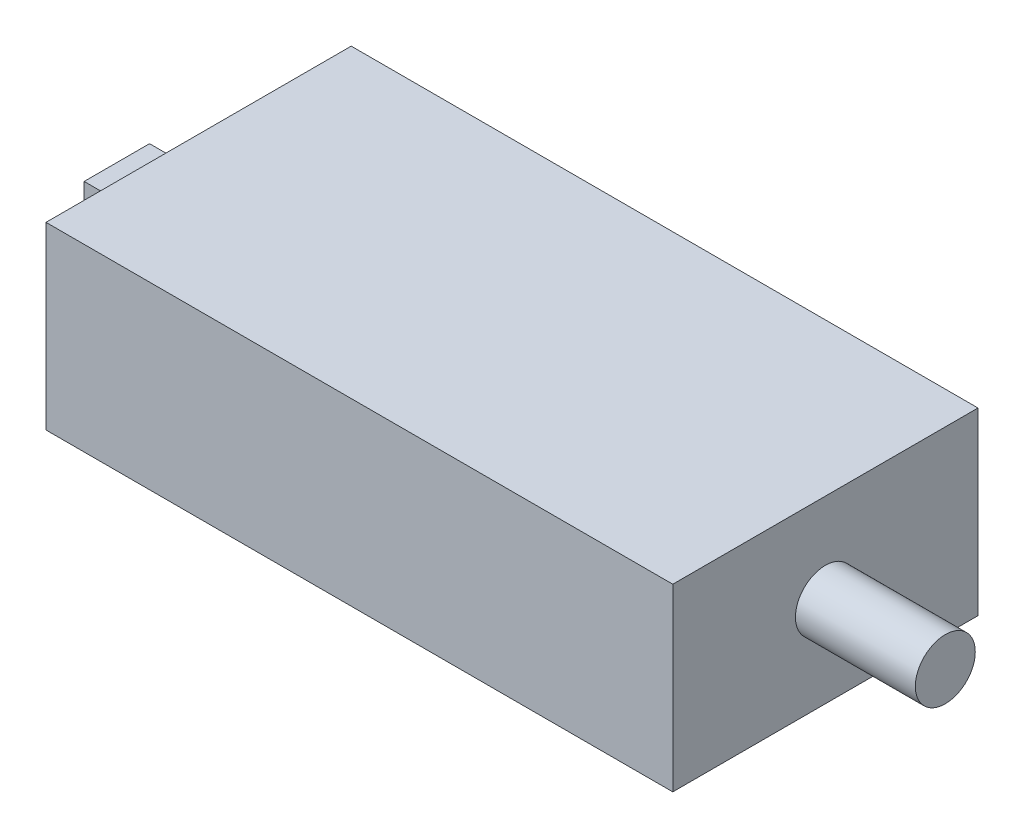
ISO-10303-21;
HEADER;
FILE_DESCRIPTION(('STEP AP214'),'2;1');
FILE_NAME('part.step','',(''),(''),'','','');
FILE_SCHEMA(('AUTOMOTIVE_DESIGN { 1 0 10303 214 1 1 1 1 }'));
ENDSEC;
DATA;
#1=APPLICATION_CONTEXT('core data for automotive mechanical design processes');
#2=APPLICATION_PROTOCOL_DEFINITION('international standard','automotive_design',2000,#1);
#3=PRODUCT_CONTEXT('',#1,'mechanical');
#4=PRODUCT('Part','Part','',(#3));
#5=PRODUCT_RELATED_PRODUCT_CATEGORY('part','',(#4));
#6=PRODUCT_DEFINITION_FORMATION('','',#4);
#7=PRODUCT_DEFINITION_CONTEXT('part definition',#1,'design');
#8=PRODUCT_DEFINITION('design','',#6,#7);
#9=PRODUCT_DEFINITION_SHAPE('','',#8);
#10=(LENGTH_UNIT() NAMED_UNIT(*) SI_UNIT(.MILLI.,.METRE.));
#11=(NAMED_UNIT(*) PLANE_ANGLE_UNIT() SI_UNIT($,.RADIAN.));
#12=(NAMED_UNIT(*) SI_UNIT($,.STERADIAN.) SOLID_ANGLE_UNIT());
#13=UNCERTAINTY_MEASURE_WITH_UNIT(LENGTH_MEASURE(1.E-05),#10,'distance_accuracy_value','');
#14=(GEOMETRIC_REPRESENTATION_CONTEXT(3) GLOBAL_UNCERTAINTY_ASSIGNED_CONTEXT((#13)) GLOBAL_UNIT_ASSIGNED_CONTEXT((#10,
#11,#12)) REPRESENTATION_CONTEXT('',''));
#15=CARTESIAN_POINT('',(0.,0.,0.));
#16=DIRECTION('',(0.,0.,1.));
#17=DIRECTION('',(1.,0.,0.));
#18=AXIS2_PLACEMENT_3D('',#15,#16,#17);
#19=CARTESIAN_POINT('',(0.,33.,0.));
#20=DIRECTION('',(1.,0.,0.));
#21=DIRECTION('',(0.,0.,-1.));
#22=AXIS2_PLACEMENT_3D('',#19,#20,#21);
#23=PLANE('',#22);
#24=DIRECTION('',(0.,0.,1.));
#25=VECTOR('',#24,1.);
#26=CARTESIAN_POINT('',(0.,0.,0.));
#27=LINE('',#26,#25);
#28=CARTESIAN_POINT('',(0.,0.,-56.));
#29=VERTEX_POINT('',#28);
#30=CARTESIAN_POINT('',(0.,0.,0.));
#31=VERTEX_POINT('',#30);
#32=EDGE_CURVE('E136',#29,#31,#27,.T.);
#33=ORIENTED_EDGE('',*,*,#32,.T.);
#34=DIRECTION('',(0.,-1.,0.));
#35=VECTOR('',#34,1.);
#36=CARTESIAN_POINT('',(0.,33.,0.));
#37=LINE('',#36,#35);
#38=CARTESIAN_POINT('',(0.,33.,0.));
#39=VERTEX_POINT('',#38);
#40=EDGE_CURVE('E46',#39,#31,#37,.T.);
#41=ORIENTED_EDGE('',*,*,#40,.F.);
#42=DIRECTION('',(0.,0.,1.));
#43=VECTOR('',#42,1.);
#44=CARTESIAN_POINT('',(0.,33.,0.));
#45=LINE('',#44,#43);
#46=CARTESIAN_POINT('',(0.,33.,-56.));
#47=VERTEX_POINT('',#46);
#48=EDGE_CURVE('E142',#47,#39,#45,.T.);
#49=ORIENTED_EDGE('',*,*,#48,.F.);
#50=DIRECTION('',(0.,-1.,0.));
#51=VECTOR('',#50,1.);
#52=CARTESIAN_POINT('',(0.,33.,-56.));
#53=LINE('',#52,#51);
#54=EDGE_CURVE('E156',#47,#29,#53,.T.);
#55=ORIENTED_EDGE('',*,*,#54,.T.);
#56=EDGE_LOOP('',(#33,#41,#49,#55));
#57=FACE_BOUND('',#56,.T.);
#58=DIRECTION('',(0.,0.,-1.));
#59=VECTOR('',#58,1.);
#60=CARTESIAN_POINT('',(0.,21.,-22.));
#61=LINE('',#60,#59);
#62=CARTESIAN_POINT('',(0.,21.,-22.));
#63=VERTEX_POINT('',#62);
#64=CARTESIAN_POINT('',(0.,21.,-34.));
#65=VERTEX_POINT('',#64);
#66=EDGE_CURVE('E59',#63,#65,#61,.T.);
#67=ORIENTED_EDGE('',*,*,#66,.F.);
#68=DIRECTION('',(0.,1.,0.));
#69=VECTOR('',#68,1.);
#70=CARTESIAN_POINT('',(0.,12.,-22.));
#71=LINE('',#70,#69);
#72=CARTESIAN_POINT('',(0.,12.,-22.));
#73=VERTEX_POINT('',#72);
#74=EDGE_CURVE('E63',#73,#63,#71,.T.);
#75=ORIENTED_EDGE('',*,*,#74,.F.);
#76=DIRECTION('',(0.,0.,1.));
#77=VECTOR('',#76,1.);
#78=CARTESIAN_POINT('',(0.,12.,-34.));
#79=LINE('',#78,#77);
#80=CARTESIAN_POINT('',(0.,12.,-34.));
#81=VERTEX_POINT('',#80);
#82=EDGE_CURVE('E347',#81,#73,#79,.T.);
#83=ORIENTED_EDGE('',*,*,#82,.F.);
#84=DIRECTION('',(0.,-1.,0.));
#85=VECTOR('',#84,1.);
#86=CARTESIAN_POINT('',(0.,16.5,-34.));
#87=LINE('',#86,#85);
#88=EDGE_CURVE('E352',#65,#81,#87,.T.);
#89=ORIENTED_EDGE('',*,*,#88,.F.);
#90=EDGE_LOOP('',(#67,#75,#83,#89));
#91=FACE_BOUND('',#90,.T.);
#92=ADVANCED_FACE('F43',(#57,#91),#23,.F.);
#93=CARTESIAN_POINT('',(0.,33.,0.));
#94=DIRECTION('',(0.,0.,-1.));
#95=DIRECTION('',(-1.,0.,0.));
#96=AXIS2_PLACEMENT_3D('',#93,#94,#95);
#97=PLANE('',#96);
#98=DIRECTION('',(1.,0.,0.));
#99=VECTOR('',#98,1.);
#100=CARTESIAN_POINT('',(0.,0.,0.));
#101=LINE('',#100,#99);
#102=CARTESIAN_POINT('',(115.,0.,0.));
#103=VERTEX_POINT('',#102);
#104=EDGE_CURVE('E160',#31,#103,#101,.T.);
#105=ORIENTED_EDGE('',*,*,#104,.T.);
#106=DIRECTION('',(0.,-1.,0.));
#107=VECTOR('',#106,1.);
#108=CARTESIAN_POINT('',(115.,33.,0.));
#109=LINE('',#108,#107);
#110=CARTESIAN_POINT('',(115.,33.,0.));
#111=VERTEX_POINT('',#110);
#112=EDGE_CURVE('E174',#111,#103,#109,.T.);
#113=ORIENTED_EDGE('',*,*,#112,.F.);
#114=DIRECTION('',(1.,0.,0.));
#115=VECTOR('',#114,1.);
#116=CARTESIAN_POINT('',(0.,33.,0.));
#117=LINE('',#116,#115);
#118=EDGE_CURVE('E146',#39,#111,#117,.T.);
#119=ORIENTED_EDGE('',*,*,#118,.F.);
#120=ORIENTED_EDGE('',*,*,#40,.T.);
#121=EDGE_LOOP('',(#105,#113,#119,#120));
#122=FACE_BOUND('',#121,.T.);
#123=ADVANCED_FACE('F185',(#122),#97,.F.);
#124=CARTESIAN_POINT('',(115.,33.,0.));
#125=DIRECTION('',(-1.,0.,0.));
#126=DIRECTION('',(0.,0.,1.));
#127=AXIS2_PLACEMENT_3D('',#124,#125,#126);
#128=PLANE('',#127);
#129=CARTESIAN_POINT('',(115.,16.5,-28.));
#130=DIRECTION('',(1.,0.,0.));
#131=DIRECTION('',(0.,0.,-1.));
#132=AXIS2_PLACEMENT_3D('',#129,#130,#131);
#133=CIRCLE('',#132,5.5);
#134=CARTESIAN_POINT('',(115.,16.5,-33.5));
#135=VERTEX_POINT('',#134);
#136=EDGE_CURVE('E11',#135,#135,#133,.T.);
#137=ORIENTED_EDGE('',*,*,#136,.F.);
#138=EDGE_LOOP('',(#137));
#139=FACE_BOUND('',#138,.T.);
#140=DIRECTION('',(0.,0.,-1.));
#141=VECTOR('',#140,1.);
#142=CARTESIAN_POINT('',(115.,0.,0.));
#143=LINE('',#142,#141);
#144=CARTESIAN_POINT('',(115.,0.,-56.));
#145=VERTEX_POINT('',#144);
#146=EDGE_CURVE('E163',#103,#145,#143,.T.);
#147=ORIENTED_EDGE('',*,*,#146,.T.);
#148=DIRECTION('',(0.,-1.,0.));
#149=VECTOR('',#148,1.);
#150=CARTESIAN_POINT('',(115.,33.,-56.));
#151=LINE('',#150,#149);
#152=CARTESIAN_POINT('',(115.,33.,-56.));
#153=VERTEX_POINT('',#152);
#154=EDGE_CURVE('E171',#153,#145,#151,.T.);
#155=ORIENTED_EDGE('',*,*,#154,.F.);
#156=DIRECTION('',(0.,0.,-1.));
#157=VECTOR('',#156,1.);
#158=CARTESIAN_POINT('',(115.,33.,0.));
#159=LINE('',#158,#157);
#160=EDGE_CURVE('E150',#111,#153,#159,.T.);
#161=ORIENTED_EDGE('',*,*,#160,.F.);
#162=ORIENTED_EDGE('',*,*,#112,.T.);
#163=EDGE_LOOP('',(#147,#155,#161,#162));
#164=FACE_BOUND('',#163,.T.);
#165=ADVANCED_FACE('F194',(#139,#164),#128,.F.);
#166=CARTESIAN_POINT('',(0.,33.,-56.));
#167=DIRECTION('',(0.,0.,1.));
#168=DIRECTION('',(1.,0.,0.));
#169=AXIS2_PLACEMENT_3D('',#166,#167,#168);
#170=PLANE('',#169);
#171=DIRECTION('',(-1.,0.,0.));
#172=VECTOR('',#171,1.);
#173=CARTESIAN_POINT('',(0.,0.,-56.));
#174=LINE('',#173,#172);
#175=EDGE_CURVE('E147',#145,#29,#174,.T.);
#176=ORIENTED_EDGE('',*,*,#175,.T.);
#177=ORIENTED_EDGE('',*,*,#54,.F.);
#178=DIRECTION('',(-1.,0.,0.));
#179=VECTOR('',#178,1.);
#180=CARTESIAN_POINT('',(0.,33.,-56.));
#181=LINE('',#180,#179);
#182=EDGE_CURVE('E153',#153,#47,#181,.T.);
#183=ORIENTED_EDGE('',*,*,#182,.F.);
#184=ORIENTED_EDGE('',*,*,#154,.T.);
#185=EDGE_LOOP('',(#176,#177,#183,#184));
#186=FACE_BOUND('',#185,.T.);
#187=ADVANCED_FACE('F197',(#186),#170,.F.);
#188=CARTESIAN_POINT('',(0.,33.,0.));
#189=DIRECTION('',(0.,-1.,0.));
#190=DIRECTION('',(0.,0.,-1.));
#191=AXIS2_PLACEMENT_3D('',#188,#189,#190);
#192=PLANE('',#191);
#193=ORIENTED_EDGE('',*,*,#48,.T.);
#194=ORIENTED_EDGE('',*,*,#118,.T.);
#195=ORIENTED_EDGE('',*,*,#160,.T.);
#196=ORIENTED_EDGE('',*,*,#182,.T.);
#197=EDGE_LOOP('',(#193,#194,#195,#196));
#198=FACE_BOUND('',#197,.T.);
#199=ADVANCED_FACE('F199',(#198),#192,.F.);
#200=CARTESIAN_POINT('',(0.,0.,0.));
#201=DIRECTION('',(0.,-1.,0.));
#202=DIRECTION('',(0.,0.,-1.));
#203=AXIS2_PLACEMENT_3D('',#200,#201,#202);
#204=PLANE('',#203);
#205=ORIENTED_EDGE('',*,*,#32,.F.);
#206=ORIENTED_EDGE('',*,*,#175,.F.);
#207=ORIENTED_EDGE('',*,*,#146,.F.);
#208=ORIENTED_EDGE('',*,*,#104,.F.);
#209=EDGE_LOOP('',(#205,#206,#207,#208));
#210=FACE_BOUND('',#209,.T.);
#211=ADVANCED_FACE('F192',(#210),#204,.T.);
#212=CARTESIAN_POINT('',(137.,16.5,-28.));
#213=DIRECTION('',(-1.,0.,0.));
#214=DIRECTION('',(0.,0.,1.));
#215=AXIS2_PLACEMENT_3D('',#212,#213,#214);
#216=CYLINDRICAL_SURFACE('',#215,5.5);
#217=CARTESIAN_POINT('',(137.,16.5,-28.));
#218=DIRECTION('',(1.,0.,0.));
#219=DIRECTION('',(0.,0.,-1.));
#220=AXIS2_PLACEMENT_3D('',#217,#218,#219);
#221=CIRCLE('',#220,5.5);
#222=CARTESIAN_POINT('',(137.,16.5,-33.5));
#223=VERTEX_POINT('',#222);
#224=EDGE_CURVE('E131',#223,#223,#221,.T.);
#225=ORIENTED_EDGE('',*,*,#224,.F.);
#226=EDGE_LOOP('',(#225));
#227=FACE_BOUND('',#226,.T.);
#228=ORIENTED_EDGE('',*,*,#136,.T.);
#229=EDGE_LOOP('',(#228));
#230=FACE_BOUND('',#229,.T.);
#231=ADVANCED_FACE('F206',(#227,#230),#216,.T.);
#232=CARTESIAN_POINT('',(137.,16.5,-28.));
#233=DIRECTION('',(1.,0.,0.));
#234=DIRECTION('',(0.,0.,-1.));
#235=AXIS2_PLACEMENT_3D('',#232,#233,#234);
#236=PLANE('',#235);
#237=ORIENTED_EDGE('',*,*,#224,.T.);
#238=EDGE_LOOP('',(#237));
#239=FACE_BOUND('',#238,.T.);
#240=ADVANCED_FACE('F224',(#239),#236,.T.);
#241=CARTESIAN_POINT('',(-15.,21.,-22.));
#242=DIRECTION('',(0.,-1.,0.));
#243=DIRECTION('',(0.,0.,-1.));
#244=AXIS2_PLACEMENT_3D('',#241,#242,#243);
#245=PLANE('',#244);
#246=ORIENTED_EDGE('',*,*,#66,.T.);
#247=DIRECTION('',(1.,0.,0.));
#248=VECTOR('',#247,1.);
#249=CARTESIAN_POINT('',(-15.,21.,-34.));
#250=LINE('',#249,#248);
#251=CARTESIAN_POINT('',(-15.,21.,-34.));
#252=VERTEX_POINT('',#251);
#253=EDGE_CURVE('E113',#252,#65,#250,.T.);
#254=ORIENTED_EDGE('',*,*,#253,.F.);
#255=DIRECTION('',(0.,0.,-1.));
#256=VECTOR('',#255,1.);
#257=CARTESIAN_POINT('',(-15.,21.,-22.));
#258=LINE('',#257,#256);
#259=CARTESIAN_POINT('',(-15.,21.,-22.));
#260=VERTEX_POINT('',#259);
#261=EDGE_CURVE('E107',#260,#252,#258,.T.);
#262=ORIENTED_EDGE('',*,*,#261,.F.);
#263=DIRECTION('',(1.,0.,0.));
#264=VECTOR('',#263,1.);
#265=CARTESIAN_POINT('',(-15.,21.,-22.));
#266=LINE('',#265,#264);
#267=EDGE_CURVE('E111',#260,#63,#266,.T.);
#268=ORIENTED_EDGE('',*,*,#267,.T.);
#269=EDGE_LOOP('',(#246,#254,#262,#268));
#270=FACE_BOUND('',#269,.T.);
#271=ADVANCED_FACE('F109',(#270),#245,.F.);
#272=CARTESIAN_POINT('',(-15.,16.5,-34.));
#273=DIRECTION('',(0.,0.,1.));
#274=DIRECTION('',(1.,0.,0.));
#275=AXIS2_PLACEMENT_3D('',#272,#273,#274);
#276=PLANE('',#275);
#277=ORIENTED_EDGE('',*,*,#88,.T.);
#278=DIRECTION('',(1.,0.,0.));
#279=VECTOR('',#278,1.);
#280=CARTESIAN_POINT('',(-15.,12.,-34.));
#281=LINE('',#280,#279);
#282=CARTESIAN_POINT('',(-15.,12.,-34.));
#283=VERTEX_POINT('',#282);
#284=EDGE_CURVE('E138',#283,#81,#281,.T.);
#285=ORIENTED_EDGE('',*,*,#284,.F.);
#286=DIRECTION('',(0.,-1.,0.));
#287=VECTOR('',#286,1.);
#288=CARTESIAN_POINT('',(-15.,21.,-34.));
#289=LINE('',#288,#287);
#290=EDGE_CURVE('E117',#252,#283,#289,.T.);
#291=ORIENTED_EDGE('',*,*,#290,.F.);
#292=ORIENTED_EDGE('',*,*,#253,.T.);
#293=EDGE_LOOP('',(#277,#285,#291,#292));
#294=FACE_BOUND('',#293,.T.);
#295=ADVANCED_FACE('F235',(#294),#276,.F.);
#296=CARTESIAN_POINT('',(-15.,12.,-34.));
#297=DIRECTION('',(0.,1.,0.));
#298=DIRECTION('',(0.,0.,1.));
#299=AXIS2_PLACEMENT_3D('',#296,#297,#298);
#300=PLANE('',#299);
#301=ORIENTED_EDGE('',*,*,#82,.T.);
#302=DIRECTION('',(1.,0.,0.));
#303=VECTOR('',#302,1.);
#304=CARTESIAN_POINT('',(-15.,12.,-22.));
#305=LINE('',#304,#303);
#306=CARTESIAN_POINT('',(-15.,12.,-22.));
#307=VERTEX_POINT('',#306);
#308=EDGE_CURVE('E348',#307,#73,#305,.T.);
#309=ORIENTED_EDGE('',*,*,#308,.F.);
#310=DIRECTION('',(0.,0.,1.));
#311=VECTOR('',#310,1.);
#312=CARTESIAN_POINT('',(-15.,12.,-34.));
#313=LINE('',#312,#311);
#314=EDGE_CURVE('E123',#283,#307,#313,.T.);
#315=ORIENTED_EDGE('',*,*,#314,.F.);
#316=ORIENTED_EDGE('',*,*,#284,.T.);
#317=EDGE_LOOP('',(#301,#309,#315,#316));
#318=FACE_BOUND('',#317,.T.);
#319=ADVANCED_FACE('F238',(#318),#300,.F.);
#320=CARTESIAN_POINT('',(-15.,12.,-22.));
#321=DIRECTION('',(0.,0.,-1.));
#322=DIRECTION('',(-1.,0.,0.));
#323=AXIS2_PLACEMENT_3D('',#320,#321,#322);
#324=PLANE('',#323);
#325=ORIENTED_EDGE('',*,*,#74,.T.);
#326=ORIENTED_EDGE('',*,*,#267,.F.);
#327=DIRECTION('',(0.,1.,0.));
#328=VECTOR('',#327,1.);
#329=CARTESIAN_POINT('',(-15.,16.5,-22.));
#330=LINE('',#329,#328);
#331=EDGE_CURVE('E118',#307,#260,#330,.T.);
#332=ORIENTED_EDGE('',*,*,#331,.F.);
#333=ORIENTED_EDGE('',*,*,#308,.T.);
#334=EDGE_LOOP('',(#325,#326,#332,#333));
#335=FACE_BOUND('',#334,.T.);
#336=ADVANCED_FACE('F129',(#335),#324,.F.);
#337=CARTESIAN_POINT('',(-15.,0.,0.));
#338=DIRECTION('',(-1.,0.,0.));
#339=DIRECTION('',(0.,0.,1.));
#340=AXIS2_PLACEMENT_3D('',#337,#338,#339);
#341=PLANE('',#340);
#342=ORIENTED_EDGE('',*,*,#331,.T.);
#343=ORIENTED_EDGE('',*,*,#261,.T.);
#344=ORIENTED_EDGE('',*,*,#290,.T.);
#345=ORIENTED_EDGE('',*,*,#314,.T.);
#346=EDGE_LOOP('',(#342,#343,#344,#345));
#347=FACE_BOUND('',#346,.T.);
#348=ADVANCED_FACE('F121',(#347),#341,.T.);
#349=CLOSED_SHELL('',(#92,#123,#165,#187,#199,#211,#231,#240,#271,#295,#319,#336,#348));
#350=MANIFOLD_SOLID_BREP('B2',#349);
#351=ADVANCED_BREP_SHAPE_REPRESENTATION('',(#18,#350),#14);
#352=SHAPE_DEFINITION_REPRESENTATION(#9,#351);
ENDSEC;
END-ISO-10303-21;
